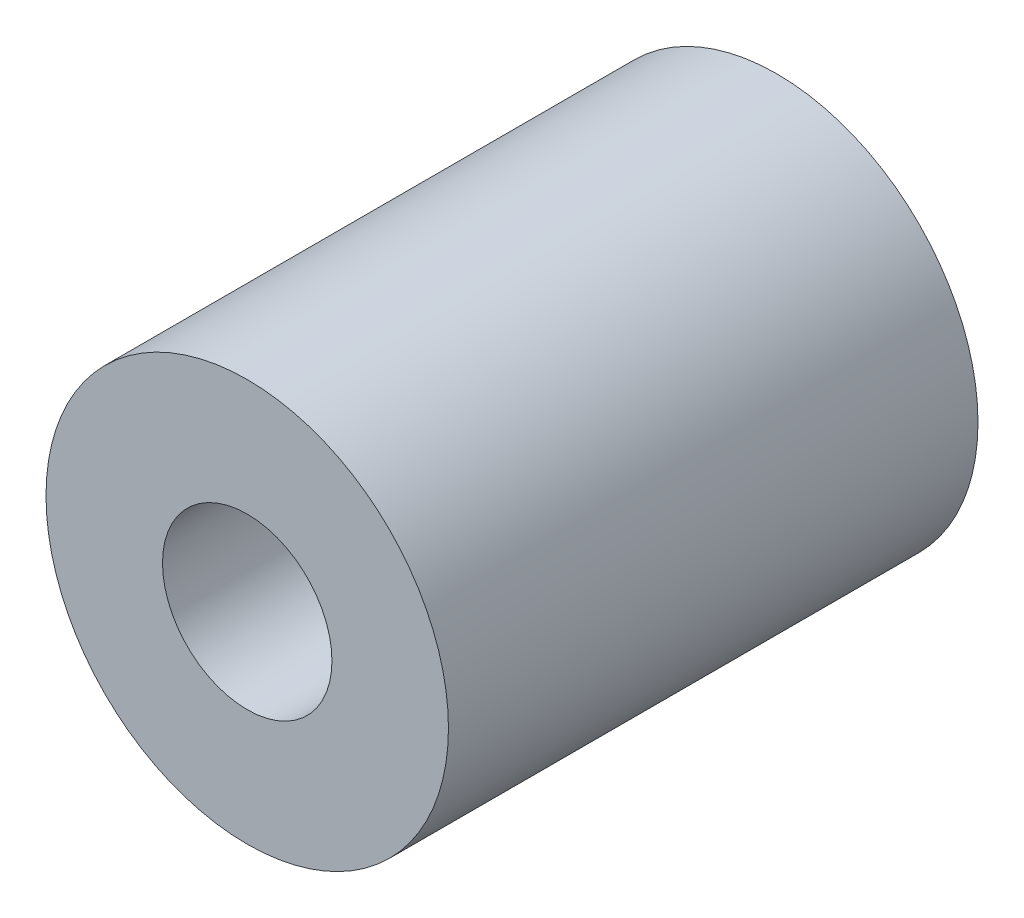
ISO-10303-21;
HEADER;
FILE_DESCRIPTION(('STEP AP214'),'2;1');
FILE_NAME('part.step','',(''),(''),'','','');
FILE_SCHEMA(('AUTOMOTIVE_DESIGN { 1 0 10303 214 1 1 1 1 }'));
ENDSEC;
DATA;
#1=APPLICATION_CONTEXT('core data for automotive mechanical design processes');
#2=APPLICATION_PROTOCOL_DEFINITION('international standard','automotive_design',2000,#1);
#3=PRODUCT_CONTEXT('',#1,'mechanical');
#4=PRODUCT('Part','Part','',(#3));
#5=PRODUCT_RELATED_PRODUCT_CATEGORY('part','',(#4));
#6=PRODUCT_DEFINITION_FORMATION('','',#4);
#7=PRODUCT_DEFINITION_CONTEXT('part definition',#1,'design');
#8=PRODUCT_DEFINITION('design','',#6,#7);
#9=PRODUCT_DEFINITION_SHAPE('','',#8);
#10=(LENGTH_UNIT() NAMED_UNIT(*) SI_UNIT(.MILLI.,.METRE.));
#11=(NAMED_UNIT(*) PLANE_ANGLE_UNIT() SI_UNIT($,.RADIAN.));
#12=(NAMED_UNIT(*) SI_UNIT($,.STERADIAN.) SOLID_ANGLE_UNIT());
#13=UNCERTAINTY_MEASURE_WITH_UNIT(LENGTH_MEASURE(1.E-05),#10,'distance_accuracy_value','');
#14=(GEOMETRIC_REPRESENTATION_CONTEXT(3) GLOBAL_UNCERTAINTY_ASSIGNED_CONTEXT((#13)) GLOBAL_UNIT_ASSIGNED_CONTEXT((#10,
#11,#12)) REPRESENTATION_CONTEXT('',''));
#15=CARTESIAN_POINT('',(0.,0.,0.));
#16=DIRECTION('',(0.,0.,1.));
#17=DIRECTION('',(1.,0.,0.));
#18=AXIS2_PLACEMENT_3D('',#15,#16,#17);
#19=CARTESIAN_POINT('',(0.,0.,25.));
#20=DIRECTION('',(0.,0.,-1.));
#21=DIRECTION('',(-1.,0.,0.));
#22=AXIS2_PLACEMENT_3D('',#19,#20,#21);
#23=CYLINDRICAL_SURFACE('',#22,9.5);
#24=CARTESIAN_POINT('',(0.,0.,25.));
#25=DIRECTION('',(0.,0.,1.));
#26=DIRECTION('',(1.,0.,0.));
#27=AXIS2_PLACEMENT_3D('',#24,#25,#26);
#28=CIRCLE('',#27,9.5);
#29=CARTESIAN_POINT('',(9.5,0.,25.));
#30=VERTEX_POINT('',#29);
#31=EDGE_CURVE('E10',#30,#30,#28,.T.);
#32=ORIENTED_EDGE('',*,*,#31,.F.);
#33=EDGE_LOOP('',(#32));
#34=FACE_BOUND('',#33,.T.);
#35=CARTESIAN_POINT('',(0.,0.,0.));
#36=DIRECTION('',(0.,0.,1.));
#37=DIRECTION('',(1.,0.,0.));
#38=AXIS2_PLACEMENT_3D('',#35,#36,#37);
#39=CIRCLE('',#38,9.5);
#40=CARTESIAN_POINT('',(9.5,0.,0.));
#41=VERTEX_POINT('',#40);
#42=EDGE_CURVE('E38',#41,#41,#39,.T.);
#43=ORIENTED_EDGE('',*,*,#42,.T.);
#44=EDGE_LOOP('',(#43));
#45=FACE_BOUND('',#44,.T.);
#46=ADVANCED_FACE('F35',(#34,#45),#23,.T.);
#47=CARTESIAN_POINT('',(0.,0.,25.));
#48=DIRECTION('',(0.,0.,1.));
#49=DIRECTION('',(1.,0.,0.));
#50=AXIS2_PLACEMENT_3D('',#47,#48,#49);
#51=PLANE('',#50);
#52=CARTESIAN_POINT('',(0.,0.,25.));
#53=DIRECTION('',(0.,0.,1.));
#54=DIRECTION('',(1.,0.,0.));
#55=AXIS2_PLACEMENT_3D('',#52,#53,#54);
#56=CIRCLE('',#55,4.);
#57=CARTESIAN_POINT('',(4.,0.,25.));
#58=VERTEX_POINT('',#57);
#59=EDGE_CURVE('E47',#58,#58,#56,.T.);
#60=ORIENTED_EDGE('',*,*,#59,.F.);
#61=EDGE_LOOP('',(#60));
#62=FACE_BOUND('',#61,.T.);
#63=ORIENTED_EDGE('',*,*,#31,.T.);
#64=EDGE_LOOP('',(#63));
#65=FACE_BOUND('',#64,.T.);
#66=ADVANCED_FACE('F72',(#62,#65),#51,.T.);
#67=CARTESIAN_POINT('',(0.,0.,0.));
#68=DIRECTION('',(0.,0.,1.));
#69=DIRECTION('',(1.,0.,0.));
#70=AXIS2_PLACEMENT_3D('',#67,#68,#69);
#71=PLANE('',#70);
#72=CARTESIAN_POINT('',(0.,0.,0.));
#73=DIRECTION('',(0.,0.,-1.));
#74=DIRECTION('',(-1.,0.,0.));
#75=AXIS2_PLACEMENT_3D('',#72,#73,#74);
#76=CIRCLE('',#75,3.);
#77=CARTESIAN_POINT('',(-3.,0.,0.));
#78=VERTEX_POINT('',#77);
#79=EDGE_CURVE('E53',#78,#78,#76,.T.);
#80=ORIENTED_EDGE('',*,*,#79,.F.);
#81=EDGE_LOOP('',(#80));
#82=FACE_BOUND('',#81,.T.);
#83=ORIENTED_EDGE('',*,*,#42,.F.);
#84=EDGE_LOOP('',(#83));
#85=FACE_BOUND('',#84,.T.);
#86=ADVANCED_FACE('F68',(#82,#85),#71,.F.);
#87=CARTESIAN_POINT('',(0.,0.,12.5));
#88=DIRECTION('',(0.,0.,1.));
#89=DIRECTION('',(1.,0.,0.));
#90=AXIS2_PLACEMENT_3D('',#87,#88,#89);
#91=CYLINDRICAL_SURFACE('',#90,4.);
#92=CARTESIAN_POINT('',(0.,0.,12.5));
#93=DIRECTION('',(0.,0.,1.));
#94=DIRECTION('',(1.,0.,0.));
#95=AXIS2_PLACEMENT_3D('',#92,#93,#94);
#96=CIRCLE('',#95,4.);
#97=CARTESIAN_POINT('',(4.,0.,12.5));
#98=VERTEX_POINT('',#97);
#99=EDGE_CURVE('E45',#98,#98,#96,.T.);
#100=ORIENTED_EDGE('',*,*,#99,.F.);
#101=EDGE_LOOP('',(#100));
#102=FACE_BOUND('',#101,.T.);
#103=ORIENTED_EDGE('',*,*,#59,.T.);
#104=EDGE_LOOP('',(#103));
#105=FACE_BOUND('',#104,.T.);
#106=ADVANCED_FACE('F71',(#102,#105),#91,.F.);
#107=CARTESIAN_POINT('',(0.,0.,12.5));
#108=DIRECTION('',(0.,0.,1.));
#109=DIRECTION('',(1.,0.,0.));
#110=AXIS2_PLACEMENT_3D('',#107,#108,#109);
#111=PLANE('',#110);
#112=CARTESIAN_POINT('',(0.,0.,12.5));
#113=DIRECTION('',(0.,0.,-1.));
#114=DIRECTION('',(-1.,0.,0.));
#115=AXIS2_PLACEMENT_3D('',#112,#113,#114);
#116=CIRCLE('',#115,3.);
#117=CARTESIAN_POINT('',(-3.,0.,12.5));
#118=VERTEX_POINT('',#117);
#119=EDGE_CURVE('E50',#118,#118,#116,.T.);
#120=ORIENTED_EDGE('',*,*,#119,.T.);
#121=EDGE_LOOP('',(#120));
#122=FACE_BOUND('',#121,.T.);
#123=ORIENTED_EDGE('',*,*,#99,.T.);
#124=EDGE_LOOP('',(#123));
#125=FACE_BOUND('',#124,.T.);
#126=ADVANCED_FACE('F59',(#122,#125),#111,.T.);
#127=CARTESIAN_POINT('',(0.,0.,12.5));
#128=DIRECTION('',(0.,0.,-1.));
#129=DIRECTION('',(-1.,0.,0.));
#130=AXIS2_PLACEMENT_3D('',#127,#128,#129);
#131=CYLINDRICAL_SURFACE('',#130,3.);
#132=ORIENTED_EDGE('',*,*,#119,.F.);
#133=EDGE_LOOP('',(#132));
#134=FACE_BOUND('',#133,.T.);
#135=ORIENTED_EDGE('',*,*,#79,.T.);
#136=EDGE_LOOP('',(#135));
#137=FACE_BOUND('',#136,.T.);
#138=ADVANCED_FACE('F62',(#134,#137),#131,.F.);
#139=CLOSED_SHELL('',(#46,#66,#86,#106,#126,#138));
#140=MANIFOLD_SOLID_BREP('B2',#139);
#141=ADVANCED_BREP_SHAPE_REPRESENTATION('',(#18,#140),#14);
#142=SHAPE_DEFINITION_REPRESENTATION(#9,#141);
ENDSEC;
END-ISO-10303-21;
